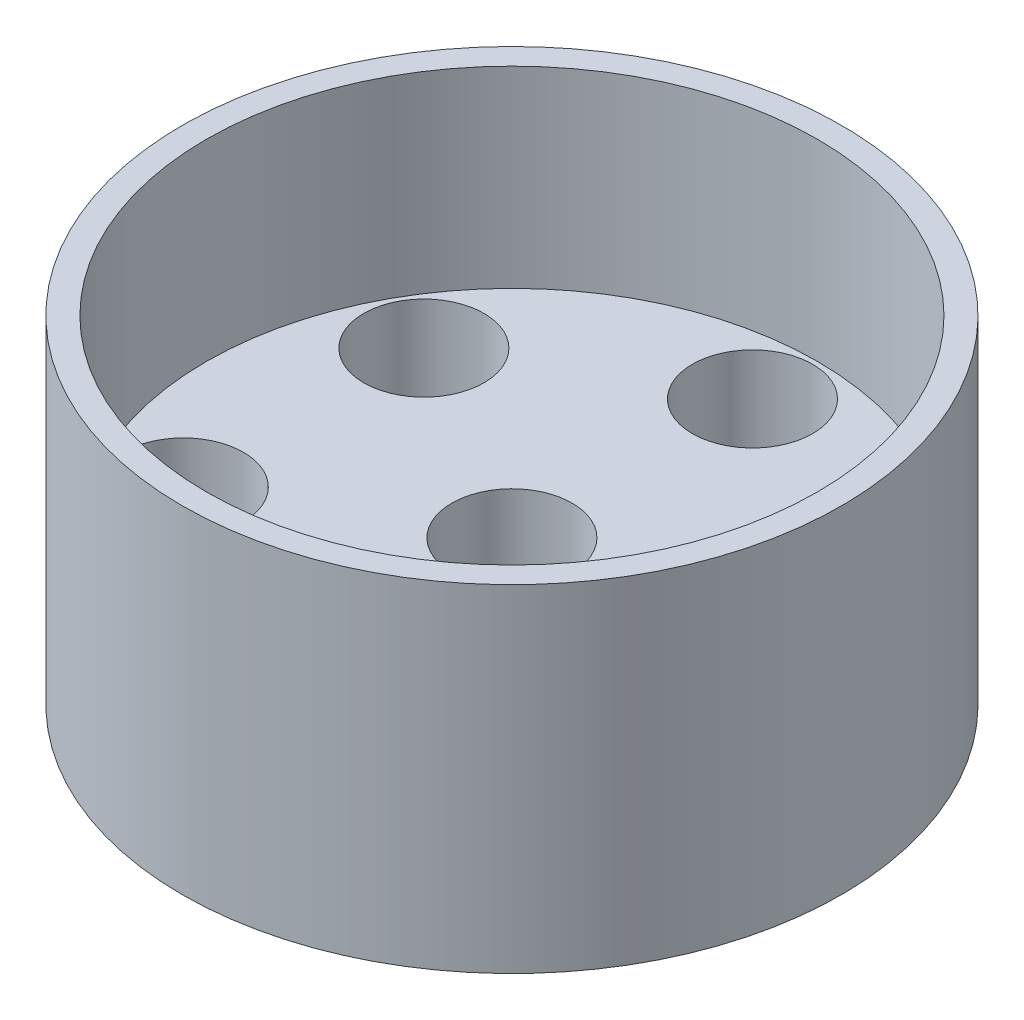
ISO-10303-21;
HEADER;
FILE_DESCRIPTION(('STEP AP214'),'2;1');
FILE_NAME('part.step','',(''),(''),'','','');
FILE_SCHEMA(('AUTOMOTIVE_DESIGN { 1 0 10303 214 1 1 1 1 }'));
ENDSEC;
DATA;
#1=APPLICATION_CONTEXT('core data for automotive mechanical design processes');
#2=APPLICATION_PROTOCOL_DEFINITION('international standard','automotive_design',2000,#1);
#3=PRODUCT_CONTEXT('',#1,'mechanical');
#4=PRODUCT('Part','Part','',(#3));
#5=PRODUCT_RELATED_PRODUCT_CATEGORY('part','',(#4));
#6=PRODUCT_DEFINITION_FORMATION('','',#4);
#7=PRODUCT_DEFINITION_CONTEXT('part definition',#1,'design');
#8=PRODUCT_DEFINITION('design','',#6,#7);
#9=PRODUCT_DEFINITION_SHAPE('','',#8);
#10=(LENGTH_UNIT() NAMED_UNIT(*) SI_UNIT(.MILLI.,.METRE.));
#11=(NAMED_UNIT(*) PLANE_ANGLE_UNIT() SI_UNIT($,.RADIAN.));
#12=(NAMED_UNIT(*) SI_UNIT($,.STERADIAN.) SOLID_ANGLE_UNIT());
#13=UNCERTAINTY_MEASURE_WITH_UNIT(LENGTH_MEASURE(1.E-05),#10,'distance_accuracy_value','');
#14=(GEOMETRIC_REPRESENTATION_CONTEXT(3) GLOBAL_UNCERTAINTY_ASSIGNED_CONTEXT((#13)) GLOBAL_UNIT_ASSIGNED_CONTEXT((#10,
#11,#12)) REPRESENTATION_CONTEXT('',''));
#15=CARTESIAN_POINT('',(0.,0.,0.));
#16=DIRECTION('',(0.,0.,1.));
#17=DIRECTION('',(1.,0.,0.));
#18=AXIS2_PLACEMENT_3D('',#15,#16,#17);
#19=CARTESIAN_POINT('',(0.,6.,0.));
#20=DIRECTION('',(0.,1.,0.));
#21=DIRECTION('',(0.,0.,1.));
#22=AXIS2_PLACEMENT_3D('',#19,#20,#21);
#23=PLANE('',#22);
#24=CARTESIAN_POINT('',(8.6602540378445,6.,-5.0000000000002));
#25=DIRECTION('',(0.,1.,0.));
#26=DIRECTION('',(0.,0.,1.));
#27=AXIS2_PLACEMENT_3D('',#24,#25,#26);
#28=CIRCLE('',#27,2.5);
#29=CARTESIAN_POINT('',(8.6602540378445,6.,-2.5000000000002));
#30=VERTEX_POINT('',#29);
#31=EDGE_CURVE('E69',#30,#30,#28,.T.);
#32=ORIENTED_EDGE('',*,*,#31,.F.);
#33=EDGE_LOOP('',(#32));
#34=FACE_BOUND('',#33,.T.);
#35=CARTESIAN_POINT('',(8.66025403784472,6.,4.9999999999998));
#36=DIRECTION('',(0.,1.,0.));
#37=DIRECTION('',(0.,0.,1.));
#38=AXIS2_PLACEMENT_3D('',#35,#36,#37);
#39=CIRCLE('',#38,2.5);
#40=CARTESIAN_POINT('',(8.66025403784472,6.,7.4999999999998));
#41=VERTEX_POINT('',#40);
#42=EDGE_CURVE('E84',#41,#41,#39,.T.);
#43=ORIENTED_EDGE('',*,*,#42,.F.);
#44=EDGE_LOOP('',(#43));
#45=FACE_BOUND('',#44,.T.);
#46=CARTESIAN_POINT('',(4.5154305125151E-13,6.,10.));
#47=DIRECTION('',(0.,1.,0.));
#48=DIRECTION('',(0.,0.,1.));
#49=AXIS2_PLACEMENT_3D('',#46,#47,#48);
#50=CIRCLE('',#49,2.5);
#51=CARTESIAN_POINT('',(4.5154305125151E-13,6.,12.5));
#52=VERTEX_POINT('',#51);
#53=EDGE_CURVE('E78',#52,#52,#50,.T.);
#54=ORIENTED_EDGE('',*,*,#53,.F.);
#55=EDGE_LOOP('',(#54));
#56=FACE_BOUND('',#55,.T.);
#57=CARTESIAN_POINT('',(-8.66025403784405,6.,5.0000000000002));
#58=DIRECTION('',(0.,1.,0.));
#59=DIRECTION('',(0.,0.,1.));
#60=AXIS2_PLACEMENT_3D('',#57,#58,#59);
#61=CIRCLE('',#60,2.5);
#62=CARTESIAN_POINT('',(-8.66025403784405,6.,7.5000000000002));
#63=VERTEX_POINT('',#62);
#64=EDGE_CURVE('E70',#63,#63,#61,.T.);
#65=ORIENTED_EDGE('',*,*,#64,.F.);
#66=EDGE_LOOP('',(#65));
#67=FACE_BOUND('',#66,.T.);
#68=CARTESIAN_POINT('',(-8.66025403784428,6.,-4.9999999999998));
#69=DIRECTION('',(0.,1.,0.));
#70=DIRECTION('',(0.,0.,1.));
#71=AXIS2_PLACEMENT_3D('',#68,#69,#70);
#72=CIRCLE('',#71,2.5);
#73=CARTESIAN_POINT('',(-8.66025403784428,6.,-2.4999999999998));
#74=VERTEX_POINT('',#73);
#75=EDGE_CURVE('E77',#74,#74,#72,.T.);
#76=ORIENTED_EDGE('',*,*,#75,.F.);
#77=EDGE_LOOP('',(#76));
#78=FACE_BOUND('',#77,.T.);
#79=CARTESIAN_POINT('',(0.,6.,-10.));
#80=DIRECTION('',(0.,1.,0.));
#81=DIRECTION('',(0.,0.,1.));
#82=AXIS2_PLACEMENT_3D('',#79,#80,#81);
#83=CIRCLE('',#82,2.5);
#84=CARTESIAN_POINT('',(0.,6.,-7.5));
#85=VERTEX_POINT('',#84);
#86=EDGE_CURVE('E66',#85,#85,#83,.T.);
#87=ORIENTED_EDGE('',*,*,#86,.F.);
#88=EDGE_LOOP('',(#87));
#89=FACE_BOUND('',#88,.T.);
#90=CARTESIAN_POINT('',(0.,6.,0.));
#91=DIRECTION('',(0.,1.,0.));
#92=DIRECTION('',(0.,0.,1.));
#93=AXIS2_PLACEMENT_3D('',#90,#91,#92);
#94=CIRCLE('',#93,2.5);
#95=CARTESIAN_POINT('',(0.,6.,2.5));
#96=VERTEX_POINT('',#95);
#97=EDGE_CURVE('E10',#96,#96,#94,.T.);
#98=ORIENTED_EDGE('',*,*,#97,.F.);
#99=EDGE_LOOP('',(#98));
#100=FACE_BOUND('',#99,.T.);
#101=CARTESIAN_POINT('',(0.,6.,0.));
#102=DIRECTION('',(0.,1.,0.));
#103=DIRECTION('',(0.,0.,1.));
#104=AXIS2_PLACEMENT_3D('',#101,#102,#103);
#105=CIRCLE('',#104,12.7);
#106=CARTESIAN_POINT('',(0.,5.99999999999999,12.7));
#107=VERTEX_POINT('',#106);
#108=EDGE_CURVE('E50',#107,#107,#105,.T.);
#109=ORIENTED_EDGE('',*,*,#108,.T.);
#110=EDGE_LOOP('',(#109));
#111=FACE_BOUND('',#110,.T.);
#112=ADVANCED_FACE('F39',(#34,#45,#56,#67,#78,#89,#100,#111),#23,.T.);
#113=CARTESIAN_POINT('',(0.,6.,0.));
#114=DIRECTION('',(0.,-1.,0.));
#115=DIRECTION('',(0.,0.,-1.));
#116=AXIS2_PLACEMENT_3D('',#113,#114,#115);
#117=CYLINDRICAL_SURFACE('',#116,2.5);
#118=ORIENTED_EDGE('',*,*,#97,.T.);
#119=EDGE_LOOP('',(#118));
#120=FACE_BOUND('',#119,.T.);
#121=CARTESIAN_POINT('',(0.,0.,0.));
#122=DIRECTION('',(0.,1.,0.));
#123=DIRECTION('',(0.,0.,1.));
#124=AXIS2_PLACEMENT_3D('',#121,#122,#123);
#125=CIRCLE('',#124,2.5);
#126=CARTESIAN_POINT('',(0.,0.,2.5));
#127=VERTEX_POINT('',#126);
#128=EDGE_CURVE('E43',#127,#127,#125,.T.);
#129=ORIENTED_EDGE('',*,*,#128,.F.);
#130=EDGE_LOOP('',(#129));
#131=FACE_BOUND('',#130,.T.);
#132=ADVANCED_FACE('F41',(#120,#131),#117,.F.);
#133=CARTESIAN_POINT('',(0.,0.,0.));
#134=DIRECTION('',(0.,1.,0.));
#135=DIRECTION('',(0.,0.,1.));
#136=AXIS2_PLACEMENT_3D('',#133,#134,#135);
#137=PLANE('',#136);
#138=CARTESIAN_POINT('',(8.6602540378445,0.,-5.0000000000002));
#139=DIRECTION('',(0.,1.,0.));
#140=DIRECTION('',(0.,0.,1.));
#141=AXIS2_PLACEMENT_3D('',#138,#139,#140);
#142=CIRCLE('',#141,2.5);
#143=CARTESIAN_POINT('',(8.6602540378445,0.,-2.5000000000002));
#144=VERTEX_POINT('',#143);
#145=EDGE_CURVE('E87',#144,#144,#142,.F.);
#146=ORIENTED_EDGE('',*,*,#145,.F.);
#147=EDGE_LOOP('',(#146));
#148=FACE_BOUND('',#147,.T.);
#149=CARTESIAN_POINT('',(8.66025403784472,0.,4.9999999999998));
#150=DIRECTION('',(0.,1.,0.));
#151=DIRECTION('',(0.,0.,1.));
#152=AXIS2_PLACEMENT_3D('',#149,#150,#151);
#153=CIRCLE('',#152,2.5);
#154=CARTESIAN_POINT('',(8.66025403784472,0.,7.4999999999998));
#155=VERTEX_POINT('',#154);
#156=EDGE_CURVE('E81',#155,#155,#153,.F.);
#157=ORIENTED_EDGE('',*,*,#156,.F.);
#158=EDGE_LOOP('',(#157));
#159=FACE_BOUND('',#158,.T.);
#160=CARTESIAN_POINT('',(4.5154305125151E-13,0.,10.));
#161=DIRECTION('',(0.,1.,0.));
#162=DIRECTION('',(0.,0.,1.));
#163=AXIS2_PLACEMENT_3D('',#160,#161,#162);
#164=CIRCLE('',#163,2.5);
#165=CARTESIAN_POINT('',(4.5154305125151E-13,0.,12.5));
#166=VERTEX_POINT('',#165);
#167=EDGE_CURVE('E73',#166,#166,#164,.F.);
#168=ORIENTED_EDGE('',*,*,#167,.F.);
#169=EDGE_LOOP('',(#168));
#170=FACE_BOUND('',#169,.T.);
#171=CARTESIAN_POINT('',(-8.66025403784405,0.,5.0000000000002));
#172=DIRECTION('',(0.,1.,0.));
#173=DIRECTION('',(0.,0.,1.));
#174=AXIS2_PLACEMENT_3D('',#171,#172,#173);
#175=CIRCLE('',#174,2.5);
#176=CARTESIAN_POINT('',(-8.66025403784405,0.,7.5000000000002));
#177=VERTEX_POINT('',#176);
#178=EDGE_CURVE('E74',#177,#177,#175,.F.);
#179=ORIENTED_EDGE('',*,*,#178,.F.);
#180=EDGE_LOOP('',(#179));
#181=FACE_BOUND('',#180,.T.);
#182=CARTESIAN_POINT('',(-8.66025403784428,0.,-4.9999999999998));
#183=DIRECTION('',(0.,1.,0.));
#184=DIRECTION('',(0.,0.,1.));
#185=AXIS2_PLACEMENT_3D('',#182,#183,#184);
#186=CIRCLE('',#185,2.5);
#187=CARTESIAN_POINT('',(-8.66025403784428,0.,-2.4999999999998));
#188=VERTEX_POINT('',#187);
#189=EDGE_CURVE('E96',#188,#188,#186,.F.);
#190=ORIENTED_EDGE('',*,*,#189,.F.);
#191=EDGE_LOOP('',(#190));
#192=FACE_BOUND('',#191,.T.);
#193=CARTESIAN_POINT('',(0.,0.,-10.));
#194=DIRECTION('',(0.,1.,0.));
#195=DIRECTION('',(0.,0.,1.));
#196=AXIS2_PLACEMENT_3D('',#193,#194,#195);
#197=CIRCLE('',#196,2.5);
#198=CARTESIAN_POINT('',(0.,0.,-7.5));
#199=VERTEX_POINT('',#198);
#200=EDGE_CURVE('E63',#199,#199,#197,.F.);
#201=ORIENTED_EDGE('',*,*,#200,.F.);
#202=EDGE_LOOP('',(#201));
#203=FACE_BOUND('',#202,.T.);
#204=ORIENTED_EDGE('',*,*,#128,.T.);
#205=EDGE_LOOP('',(#204));
#206=FACE_BOUND('',#205,.T.);
#207=CARTESIAN_POINT('',(0.,0.,0.));
#208=DIRECTION('',(0.,1.,0.));
#209=DIRECTION('',(0.,0.,1.));
#210=AXIS2_PLACEMENT_3D('',#207,#208,#209);
#211=CIRCLE('',#210,13.7);
#212=CARTESIAN_POINT('',(0.,0.,13.7));
#213=VERTEX_POINT('',#212);
#214=EDGE_CURVE('E54',#213,#213,#211,.F.);
#215=ORIENTED_EDGE('',*,*,#214,.T.);
#216=EDGE_LOOP('',(#215));
#217=FACE_BOUND('',#216,.T.);
#218=ADVANCED_FACE('F103',(#148,#159,#170,#181,#192,#203,#206,#217),#137,.F.);
#219=CARTESIAN_POINT('',(0.,-38.7494516090228,0.));
#220=DIRECTION('',(0.,1.,0.));
#221=DIRECTION('',(0.,0.,1.));
#222=AXIS2_PLACEMENT_3D('',#219,#220,#221);
#223=CYLINDRICAL_SURFACE('',#222,13.7);
#224=CARTESIAN_POINT('',(0.,14.,0.));
#225=DIRECTION('',(0.,1.,0.));
#226=DIRECTION('',(0.,0.,1.));
#227=AXIS2_PLACEMENT_3D('',#224,#225,#226);
#228=CIRCLE('',#227,13.7);
#229=CARTESIAN_POINT('',(0.,14.,13.7));
#230=VERTEX_POINT('',#229);
#231=EDGE_CURVE('E57',#230,#230,#228,.T.);
#232=CARTESIAN_POINT('',(0.,0.,13.7));
#233=CARTESIAN_POINT('',(0.,0.145833333333333,13.7));
#234=CARTESIAN_POINT('',(0.,0.291666666666667,13.7));
#235=CARTESIAN_POINT('',(0.,0.583333333333334,13.7));
#236=CARTESIAN_POINT('',(0.,0.729166666666667,13.7));
#237=CARTESIAN_POINT('',(0.,1.02083333333333,13.7));
#238=CARTESIAN_POINT('',(0.,1.16666666666667,13.7));
#239=CARTESIAN_POINT('',(0.,1.45833333333333,13.7));
#240=CARTESIAN_POINT('',(0.,1.60416666666667,13.7));
#241=CARTESIAN_POINT('',(0.,1.89583333333334,13.7));
#242=CARTESIAN_POINT('',(0.,2.04166666666667,13.7));
#243=CARTESIAN_POINT('',(0.,2.33333333333334,13.7));
#244=CARTESIAN_POINT('',(0.,2.47916666666667,13.7));
#245=CARTESIAN_POINT('',(0.,2.77083333333334,13.7));
#246=CARTESIAN_POINT('',(0.,2.91666666666667,13.7));
#247=CARTESIAN_POINT('',(0.,3.20833333333334,13.7));
#248=CARTESIAN_POINT('',(0.,3.35416666666667,13.7));
#249=CARTESIAN_POINT('',(0.,3.64583333333333,13.7));
#250=CARTESIAN_POINT('',(0.,3.79166666666667,13.7));
#251=CARTESIAN_POINT('',(0.,4.08333333333333,13.7));
#252=CARTESIAN_POINT('',(0.,4.22916666666666,13.7));
#253=CARTESIAN_POINT('',(0.,4.52083333333333,13.7));
#254=CARTESIAN_POINT('',(0.,4.66666666666666,13.7));
#255=CARTESIAN_POINT('',(0.,4.95833333333333,13.7));
#256=CARTESIAN_POINT('',(0.,5.10416666666666,13.7));
#257=CARTESIAN_POINT('',(0.,5.39583333333333,13.7));
#258=CARTESIAN_POINT('',(0.,5.54166666666666,13.7));
#259=CARTESIAN_POINT('',(0.,5.83333333333333,13.7));
#260=CARTESIAN_POINT('',(0.,5.97916666666667,13.7));
#261=CARTESIAN_POINT('',(0.,6.27083333333333,13.7));
#262=CARTESIAN_POINT('',(0.,6.41666666666667,13.7));
#263=CARTESIAN_POINT('',(0.,6.70833333333333,13.7));
#264=CARTESIAN_POINT('',(0.,6.85416666666667,13.7));
#265=CARTESIAN_POINT('',(0.,7.14583333333333,13.7));
#266=CARTESIAN_POINT('',(0.,7.29166666666667,13.7));
#267=CARTESIAN_POINT('',(0.,7.58333333333333,13.7));
#268=CARTESIAN_POINT('',(0.,7.72916666666667,13.7));
#269=CARTESIAN_POINT('',(0.,8.02083333333333,13.7));
#270=CARTESIAN_POINT('',(0.,8.16666666666667,13.7));
#271=CARTESIAN_POINT('',(0.,8.45833333333333,13.7));
#272=CARTESIAN_POINT('',(0.,8.60416666666667,13.7));
#273=CARTESIAN_POINT('',(0.,8.89583333333333,13.7));
#274=CARTESIAN_POINT('',(0.,9.04166666666667,13.7));
#275=CARTESIAN_POINT('',(0.,9.33333333333333,13.7));
#276=CARTESIAN_POINT('',(0.,9.47916666666666,13.7));
#277=CARTESIAN_POINT('',(0.,9.77083333333333,13.7));
#278=CARTESIAN_POINT('',(0.,9.91666666666667,13.7));
#279=CARTESIAN_POINT('',(0.,10.2083333333333,13.7));
#280=CARTESIAN_POINT('',(0.,10.3541666666667,13.7));
#281=CARTESIAN_POINT('',(0.,10.6458333333333,13.7));
#282=CARTESIAN_POINT('',(0.,10.7916666666667,13.7));
#283=CARTESIAN_POINT('',(0.,11.0833333333333,13.7));
#284=CARTESIAN_POINT('',(0.,11.2291666666667,13.7));
#285=CARTESIAN_POINT('',(0.,11.5208333333333,13.7));
#286=CARTESIAN_POINT('',(0.,11.6666666666667,13.7));
#287=CARTESIAN_POINT('',(0.,11.9583333333333,13.7));
#288=CARTESIAN_POINT('',(0.,12.1041666666667,13.7));
#289=CARTESIAN_POINT('',(0.,12.3958333333333,13.7));
#290=CARTESIAN_POINT('',(0.,12.5416666666667,13.7));
#291=CARTESIAN_POINT('',(0.,12.8333333333333,13.7));
#292=CARTESIAN_POINT('',(0.,12.9791666666667,13.7));
#293=CARTESIAN_POINT('',(0.,13.2708333333333,13.7));
#294=CARTESIAN_POINT('',(0.,13.4166666666667,13.7));
#295=CARTESIAN_POINT('',(0.,13.7083333333333,13.7));
#296=CARTESIAN_POINT('',(0.,13.8541666666667,13.7));
#297=CARTESIAN_POINT('',(0.,14.,13.7));
#298=B_SPLINE_CURVE_WITH_KNOTS('',3,(#232,#233,#234,#235,#236,#237,#238,#239,#240,#241,#242,
#243,#244,#245,#246,#247,#248,#249,#250,#251,#252,#253,#254,#255,#256,#257,#258,#259,#260,#261,
#262,#263,#264,#265,#266,#267,#268,#269,#270,#271,#272,#273,#274,#275,#276,#277,#278,#279,#280,
#281,#282,#283,#284,#285,#286,#287,#288,#289,#290,#291,#292,#293,#294,#295,#296,#297),
.UNSPECIFIED.,.F.,.F.,(4,2,2,2,2,2,2,2,2,2,2,2,2,2,2,2,2,2,2,2,2,2,2,2,2,2,2,2,2,2,2,2,4),(0.,
0.4375,0.875000000000001,1.3125,1.75,2.1875,2.625,3.0625,3.5,3.9375,4.375,4.8125,5.25,5.6875,
6.125,6.5625,7.,7.4375,7.875,8.3125,8.75,9.1875,9.62499999999999,10.0625,10.5,10.9375,11.375,
11.8125,12.25,12.6875,13.125,13.5625,14.),.UNSPECIFIED.);
#299=EDGE_CURVE('BSEAM106',#213,#230,#298,.T.);
#300=ORIENTED_EDGE('',*,*,#214,.F.);
#301=ORIENTED_EDGE('',*,*,#231,.F.);
#302=ORIENTED_EDGE('',*,*,#299,.T.);
#303=ORIENTED_EDGE('',*,*,#299,.F.);
#304=EDGE_LOOP('',(#300,#302,#301,#303));
#305=FACE_BOUND('',#304,.T.);
#306=ADVANCED_FACE('F106',(#305),#223,.T.);
#307=CARTESIAN_POINT('',(0.,-38.7494516090228,0.));
#308=DIRECTION('',(0.,1.,0.));
#309=DIRECTION('',(0.,0.,1.));
#310=AXIS2_PLACEMENT_3D('',#307,#308,#309);
#311=CYLINDRICAL_SURFACE('',#310,12.7);
#312=CARTESIAN_POINT('',(0.,14.,0.));
#313=DIRECTION('',(0.,1.,0.));
#314=DIRECTION('',(0.,0.,1.));
#315=AXIS2_PLACEMENT_3D('',#312,#313,#314);
#316=CIRCLE('',#315,12.7);
#317=CARTESIAN_POINT('',(0.,14.,12.7));
#318=VERTEX_POINT('',#317);
#319=EDGE_CURVE('E60',#318,#318,#316,.T.);
#320=CARTESIAN_POINT('',(0.,5.99999999999999,12.7));
#321=CARTESIAN_POINT('',(0.,6.08333333333333,12.7));
#322=CARTESIAN_POINT('',(0.,6.16666666666666,12.7));
#323=CARTESIAN_POINT('',(0.,6.33333333333333,12.7));
#324=CARTESIAN_POINT('',(0.,6.41666666666666,12.7));
#325=CARTESIAN_POINT('',(0.,6.58333333333333,12.7));
#326=CARTESIAN_POINT('',(0.,6.66666666666666,12.7));
#327=CARTESIAN_POINT('',(0.,6.83333333333333,12.7));
#328=CARTESIAN_POINT('',(0.,6.91666666666666,12.7));
#329=CARTESIAN_POINT('',(0.,7.08333333333333,12.7));
#330=CARTESIAN_POINT('',(0.,7.16666666666666,12.7));
#331=CARTESIAN_POINT('',(0.,7.33333333333333,12.7));
#332=CARTESIAN_POINT('',(0.,7.41666666666666,12.7));
#333=CARTESIAN_POINT('',(0.,7.58333333333333,12.7));
#334=CARTESIAN_POINT('',(0.,7.66666666666666,12.7));
#335=CARTESIAN_POINT('',(0.,7.83333333333333,12.7));
#336=CARTESIAN_POINT('',(0.,7.91666666666666,12.7));
#337=CARTESIAN_POINT('',(0.,8.08333333333333,12.7));
#338=CARTESIAN_POINT('',(0.,8.16666666666666,12.7));
#339=CARTESIAN_POINT('',(0.,8.33333333333333,12.7));
#340=CARTESIAN_POINT('',(0.,8.41666666666666,12.7));
#341=CARTESIAN_POINT('',(0.,8.58333333333333,12.7));
#342=CARTESIAN_POINT('',(0.,8.66666666666666,12.7));
#343=CARTESIAN_POINT('',(0.,8.83333333333333,12.7));
#344=CARTESIAN_POINT('',(0.,8.91666666666666,12.7));
#345=CARTESIAN_POINT('',(0.,9.08333333333333,12.7));
#346=CARTESIAN_POINT('',(0.,9.16666666666666,12.7));
#347=CARTESIAN_POINT('',(0.,9.33333333333333,12.7));
#348=CARTESIAN_POINT('',(0.,9.41666666666666,12.7));
#349=CARTESIAN_POINT('',(0.,9.58333333333333,12.7));
#350=CARTESIAN_POINT('',(0.,9.66666666666666,12.7));
#351=CARTESIAN_POINT('',(0.,9.83333333333333,12.7));
#352=CARTESIAN_POINT('',(0.,9.91666666666666,12.7));
#353=CARTESIAN_POINT('',(0.,10.0833333333333,12.7));
#354=CARTESIAN_POINT('',(0.,10.1666666666667,12.7));
#355=CARTESIAN_POINT('',(0.,10.3333333333333,12.7));
#356=CARTESIAN_POINT('',(0.,10.4166666666667,12.7));
#357=CARTESIAN_POINT('',(0.,10.5833333333333,12.7));
#358=CARTESIAN_POINT('',(0.,10.6666666666667,12.7));
#359=CARTESIAN_POINT('',(0.,10.8333333333333,12.7));
#360=CARTESIAN_POINT('',(0.,10.9166666666667,12.7));
#361=CARTESIAN_POINT('',(0.,11.0833333333333,12.7));
#362=CARTESIAN_POINT('',(0.,11.1666666666667,12.7));
#363=CARTESIAN_POINT('',(0.,11.3333333333333,12.7));
#364=CARTESIAN_POINT('',(0.,11.4166666666667,12.7));
#365=CARTESIAN_POINT('',(0.,11.5833333333333,12.7));
#366=CARTESIAN_POINT('',(0.,11.6666666666667,12.7));
#367=CARTESIAN_POINT('',(0.,11.8333333333333,12.7));
#368=CARTESIAN_POINT('',(0.,11.9166666666667,12.7));
#369=CARTESIAN_POINT('',(0.,12.0833333333333,12.7));
#370=CARTESIAN_POINT('',(0.,12.1666666666667,12.7));
#371=CARTESIAN_POINT('',(0.,12.3333333333333,12.7));
#372=CARTESIAN_POINT('',(0.,12.4166666666667,12.7));
#373=CARTESIAN_POINT('',(0.,12.5833333333333,12.7));
#374=CARTESIAN_POINT('',(0.,12.6666666666667,12.7));
#375=CARTESIAN_POINT('',(0.,12.8333333333333,12.7));
#376=CARTESIAN_POINT('',(0.,12.9166666666667,12.7));
#377=CARTESIAN_POINT('',(0.,13.0833333333333,12.7));
#378=CARTESIAN_POINT('',(0.,13.1666666666667,12.7));
#379=CARTESIAN_POINT('',(0.,13.3333333333333,12.7));
#380=CARTESIAN_POINT('',(0.,13.4166666666667,12.7));
#381=CARTESIAN_POINT('',(0.,13.5833333333333,12.7));
#382=CARTESIAN_POINT('',(0.,13.6666666666667,12.7));
#383=CARTESIAN_POINT('',(0.,13.8333333333333,12.7));
#384=CARTESIAN_POINT('',(0.,13.9166666666667,12.7));
#385=CARTESIAN_POINT('',(0.,14.,12.7));
#386=B_SPLINE_CURVE_WITH_KNOTS('',3,(#320,#321,#322,#323,#324,#325,#326,#327,#328,#329,#330,
#331,#332,#333,#334,#335,#336,#337,#338,#339,#340,#341,#342,#343,#344,#345,#346,#347,#348,#349,
#350,#351,#352,#353,#354,#355,#356,#357,#358,#359,#360,#361,#362,#363,#364,#365,#366,#367,#368,
#369,#370,#371,#372,#373,#374,#375,#376,#377,#378,#379,#380,#381,#382,#383,#384,#385),
.UNSPECIFIED.,.F.,.F.,(4,2,2,2,2,2,2,2,2,2,2,2,2,2,2,2,2,2,2,2,2,2,2,2,2,2,2,2,2,2,2,2,4),(0.,
0.25,0.5,0.750000000000001,1.,1.25,1.5,1.75,2.,2.25,2.5,2.75,3.,3.25,3.5,3.75,4.,4.25,4.5,4.75,
5.,5.25,5.50000000000001,5.75000000000001,6.00000000000001,6.25000000000001,6.50000000000001,
6.75000000000001,7.00000000000001,7.25000000000001,7.50000000000001,7.75000000000001,
8.00000000000001),.UNSPECIFIED.);
#387=EDGE_CURVE('BSEAM116',#107,#318,#386,.T.);
#388=ORIENTED_EDGE('',*,*,#108,.F.);
#389=ORIENTED_EDGE('',*,*,#319,.T.);
#390=ORIENTED_EDGE('',*,*,#387,.T.);
#391=ORIENTED_EDGE('',*,*,#387,.F.);
#392=EDGE_LOOP('',(#388,#390,#389,#391));
#393=FACE_BOUND('',#392,.T.);
#394=ADVANCED_FACE('F116',(#393),#311,.F.);
#395=CARTESIAN_POINT('',(0.,14.,0.));
#396=DIRECTION('',(0.,1.,0.));
#397=DIRECTION('',(0.,0.,1.));
#398=AXIS2_PLACEMENT_3D('',#395,#396,#397);
#399=PLANE('',#398);
#400=ORIENTED_EDGE('',*,*,#231,.T.);
#401=EDGE_LOOP('',(#400));
#402=FACE_BOUND('',#401,.T.);
#403=ORIENTED_EDGE('',*,*,#319,.F.);
#404=EDGE_LOOP('',(#403));
#405=FACE_BOUND('',#404,.T.);
#406=ADVANCED_FACE('F120',(#402,#405),#399,.T.);
#407=CARTESIAN_POINT('',(0.,-7.07106781186548,-10.));
#408=DIRECTION('',(0.,1.,0.));
#409=DIRECTION('',(0.,0.,1.));
#410=AXIS2_PLACEMENT_3D('',#407,#408,#409);
#411=CYLINDRICAL_SURFACE('',#410,2.5);
#412=ORIENTED_EDGE('',*,*,#200,.T.);
#413=EDGE_LOOP('',(#412));
#414=FACE_BOUND('',#413,.T.);
#415=ORIENTED_EDGE('',*,*,#86,.T.);
#416=EDGE_LOOP('',(#415));
#417=FACE_BOUND('',#416,.T.);
#418=ADVANCED_FACE('F123',(#414,#417),#411,.F.);
#419=CARTESIAN_POINT('',(-8.66025403784428,-7.07106781186548,-4.9999999999998));
#420=DIRECTION('',(0.,1.,0.));
#421=DIRECTION('',(0.,0.,1.));
#422=AXIS2_PLACEMENT_3D('',#419,#420,#421);
#423=CYLINDRICAL_SURFACE('',#422,2.5);
#424=ORIENTED_EDGE('',*,*,#189,.T.);
#425=EDGE_LOOP('',(#424));
#426=FACE_BOUND('',#425,.T.);
#427=ORIENTED_EDGE('',*,*,#75,.T.);
#428=EDGE_LOOP('',(#427));
#429=FACE_BOUND('',#428,.T.);
#430=ADVANCED_FACE('F100',(#426,#429),#423,.F.);
#431=CARTESIAN_POINT('',(-8.66025403784405,-7.07106781186548,5.0000000000002));
#432=DIRECTION('',(0.,1.,0.));
#433=DIRECTION('',(0.,0.,1.));
#434=AXIS2_PLACEMENT_3D('',#431,#432,#433);
#435=CYLINDRICAL_SURFACE('',#434,2.5);
#436=ORIENTED_EDGE('',*,*,#178,.T.);
#437=EDGE_LOOP('',(#436));
#438=FACE_BOUND('',#437,.T.);
#439=ORIENTED_EDGE('',*,*,#64,.T.);
#440=EDGE_LOOP('',(#439));
#441=FACE_BOUND('',#440,.T.);
#442=ADVANCED_FACE('F159',(#438,#441),#435,.F.);
#443=CARTESIAN_POINT('',(4.5154305125151E-13,-7.07106781186548,10.));
#444=DIRECTION('',(0.,1.,0.));
#445=DIRECTION('',(0.,0.,1.));
#446=AXIS2_PLACEMENT_3D('',#443,#444,#445);
#447=CYLINDRICAL_SURFACE('',#446,2.5);
#448=ORIENTED_EDGE('',*,*,#167,.T.);
#449=EDGE_LOOP('',(#448));
#450=FACE_BOUND('',#449,.T.);
#451=ORIENTED_EDGE('',*,*,#53,.T.);
#452=EDGE_LOOP('',(#451));
#453=FACE_BOUND('',#452,.T.);
#454=ADVANCED_FACE('F164',(#450,#453),#447,.F.);
#455=CARTESIAN_POINT('',(8.66025403784472,-7.07106781186548,4.9999999999998));
#456=DIRECTION('',(0.,1.,0.));
#457=DIRECTION('',(0.,0.,1.));
#458=AXIS2_PLACEMENT_3D('',#455,#456,#457);
#459=CYLINDRICAL_SURFACE('',#458,2.5);
#460=ORIENTED_EDGE('',*,*,#156,.T.);
#461=EDGE_LOOP('',(#460));
#462=FACE_BOUND('',#461,.T.);
#463=ORIENTED_EDGE('',*,*,#42,.T.);
#464=EDGE_LOOP('',(#463));
#465=FACE_BOUND('',#464,.T.);
#466=ADVANCED_FACE('F168',(#462,#465),#459,.F.);
#467=CARTESIAN_POINT('',(8.6602540378445,-7.07106781186548,-5.0000000000002));
#468=DIRECTION('',(0.,1.,0.));
#469=DIRECTION('',(0.,0.,1.));
#470=AXIS2_PLACEMENT_3D('',#467,#468,#469);
#471=CYLINDRICAL_SURFACE('',#470,2.5);
#472=ORIENTED_EDGE('',*,*,#145,.T.);
#473=EDGE_LOOP('',(#472));
#474=FACE_BOUND('',#473,.T.);
#475=ORIENTED_EDGE('',*,*,#31,.T.);
#476=EDGE_LOOP('',(#475));
#477=FACE_BOUND('',#476,.T.);
#478=ADVANCED_FACE('F172',(#474,#477),#471,.F.);
#479=CLOSED_SHELL('',(#112,#132,#218,#306,#394,#406,#418,#430,#442,#454,#466,#478));
#480=MANIFOLD_SOLID_BREP('B2',#479);
#481=ADVANCED_BREP_SHAPE_REPRESENTATION('',(#18,#480),#14);
#482=SHAPE_DEFINITION_REPRESENTATION(#9,#481);
ENDSEC;
END-ISO-10303-21;
